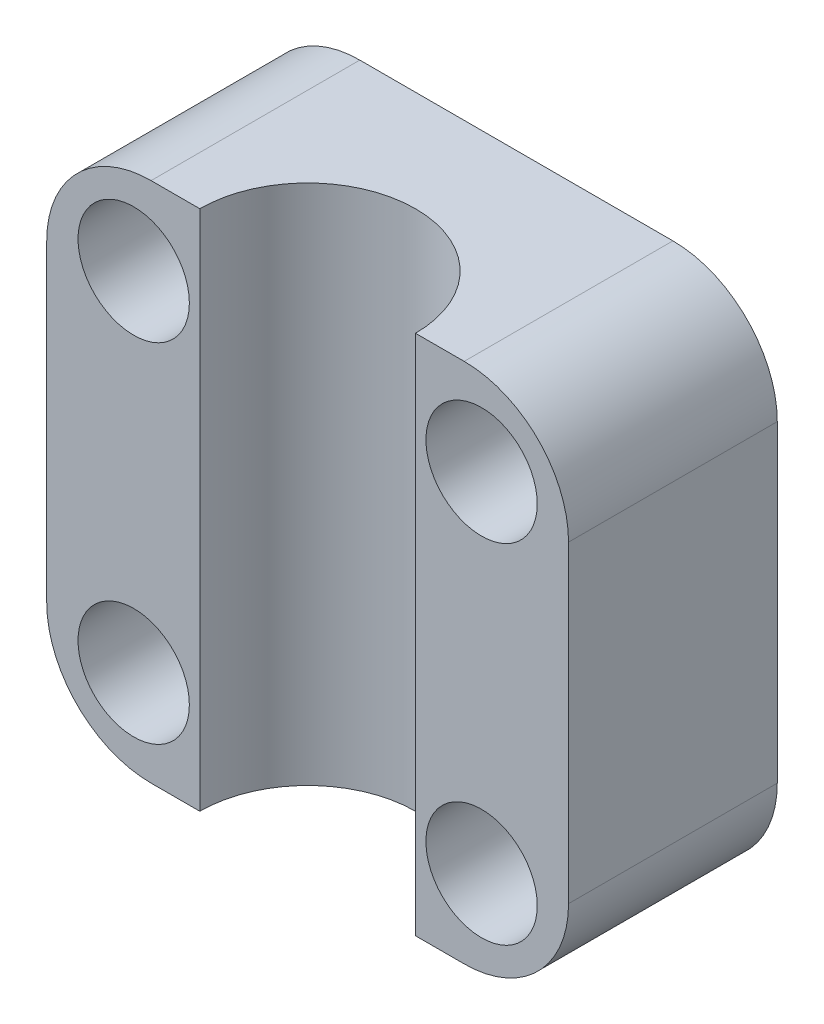
ISO-10303-21;
HEADER;
FILE_DESCRIPTION(('STEP AP214'),'2;1');
FILE_NAME('part.step','',(''),(''),'','','');
FILE_SCHEMA(('AUTOMOTIVE_DESIGN { 1 0 10303 214 1 1 1 1 }'));
ENDSEC;
DATA;
#1=APPLICATION_CONTEXT('core data for automotive mechanical design processes');
#2=APPLICATION_PROTOCOL_DEFINITION('international standard','automotive_design',2000,#1);
#3=PRODUCT_CONTEXT('',#1,'mechanical');
#4=PRODUCT('Part','Part','',(#3));
#5=PRODUCT_RELATED_PRODUCT_CATEGORY('part','',(#4));
#6=PRODUCT_DEFINITION_FORMATION('','',#4);
#7=PRODUCT_DEFINITION_CONTEXT('part definition',#1,'design');
#8=PRODUCT_DEFINITION('design','',#6,#7);
#9=PRODUCT_DEFINITION_SHAPE('','',#8);
#10=(LENGTH_UNIT() NAMED_UNIT(*) SI_UNIT(.MILLI.,.METRE.));
#11=(NAMED_UNIT(*) PLANE_ANGLE_UNIT() SI_UNIT($,.RADIAN.));
#12=(NAMED_UNIT(*) SI_UNIT($,.STERADIAN.) SOLID_ANGLE_UNIT());
#13=UNCERTAINTY_MEASURE_WITH_UNIT(LENGTH_MEASURE(1.E-05),#10,'distance_accuracy_value','');
#14=(GEOMETRIC_REPRESENTATION_CONTEXT(3) GLOBAL_UNCERTAINTY_ASSIGNED_CONTEXT((#13)) GLOBAL_UNIT_ASSIGNED_CONTEXT((#10,
#11,#12)) REPRESENTATION_CONTEXT('',''));
#15=CARTESIAN_POINT('',(0.,0.,0.));
#16=DIRECTION('',(0.,0.,1.));
#17=DIRECTION('',(1.,0.,0.));
#18=AXIS2_PLACEMENT_3D('',#15,#16,#17);
#19=CARTESIAN_POINT('',(-7.5,7.5,-6.));
#20=DIRECTION('',(0.,1.,0.));
#21=DIRECTION('',(-1.,0.,0.));
#22=AXIS2_PLACEMENT_3D('',#19,#20,#21);
#23=PLANE('',#22);
#24=DIRECTION('',(-1.,0.,0.));
#25=VECTOR('',#24,1.);
#26=CARTESIAN_POINT('',(-7.5,7.5,-6.));
#27=LINE('',#26,#25);
#28=CARTESIAN_POINT('',(4.5,7.5,-6.));
#29=VERTEX_POINT('',#28);
#30=CARTESIAN_POINT('',(-4.5,7.5,-6.));
#31=VERTEX_POINT('',#30);
#32=EDGE_CURVE('E175',#29,#31,#27,.T.);
#33=ORIENTED_EDGE('',*,*,#32,.T.);
#34=DIRECTION('',(0.,0.,1.));
#35=VECTOR('',#34,1.);
#36=CARTESIAN_POINT('',(-4.5,7.5,-6.));
#37=LINE('',#36,#35);
#38=CARTESIAN_POINT('',(-4.5,7.5,0.));
#39=VERTEX_POINT('',#38);
#40=EDGE_CURVE('E185',#31,#39,#37,.T.);
#41=ORIENTED_EDGE('',*,*,#40,.T.);
#42=DIRECTION('',(-1.,0.,0.));
#43=VECTOR('',#42,1.);
#44=CARTESIAN_POINT('',(-7.5,7.5,0.));
#45=LINE('',#44,#43);
#46=CARTESIAN_POINT('',(-3.1,7.5,0.));
#47=VERTEX_POINT('',#46);
#48=EDGE_CURVE('E181',#47,#39,#45,.T.);
#49=ORIENTED_EDGE('',*,*,#48,.F.);
#50=CARTESIAN_POINT('',(0.,7.5,0.));
#51=DIRECTION('',(0.,1.,0.));
#52=DIRECTION('',(0.,0.,1.));
#53=AXIS2_PLACEMENT_3D('',#50,#51,#52);
#54=CIRCLE('',#53,3.1);
#55=CARTESIAN_POINT('',(3.1,7.5,0.));
#56=VERTEX_POINT('',#55);
#57=EDGE_CURVE('E130',#56,#47,#54,.T.);
#58=ORIENTED_EDGE('',*,*,#57,.F.);
#59=CARTESIAN_POINT('',(4.5,7.5,0.));
#60=VERTEX_POINT('',#59);
#61=EDGE_CURVE('E170',#60,#56,#45,.T.);
#62=ORIENTED_EDGE('',*,*,#61,.F.);
#63=DIRECTION('',(0.,0.,1.));
#64=VECTOR('',#63,1.);
#65=CARTESIAN_POINT('',(4.5,7.5,-6.));
#66=LINE('',#65,#64);
#67=EDGE_CURVE('E131',#60,#29,#66,.F.);
#68=ORIENTED_EDGE('',*,*,#67,.T.);
#69=EDGE_LOOP('',(#33,#41,#49,#58,#62,#68));
#70=FACE_BOUND('',#69,.T.);
#71=ADVANCED_FACE('F32',(#70),#23,.T.);
#72=CARTESIAN_POINT('',(-7.5,-7.5,-6.));
#73=DIRECTION('',(0.,-1.,0.));
#74=DIRECTION('',(1.,0.,0.));
#75=AXIS2_PLACEMENT_3D('',#72,#73,#74);
#76=PLANE('',#75);
#77=DIRECTION('',(1.,0.,0.));
#78=VECTOR('',#77,1.);
#79=CARTESIAN_POINT('',(-7.5,-7.5,-6.));
#80=LINE('',#79,#78);
#81=CARTESIAN_POINT('',(-4.5,-7.5,-6.));
#82=VERTEX_POINT('',#81);
#83=CARTESIAN_POINT('',(4.5,-7.5,-6.));
#84=VERTEX_POINT('',#83);
#85=EDGE_CURVE('E169',#82,#84,#80,.T.);
#86=ORIENTED_EDGE('',*,*,#85,.T.);
#87=DIRECTION('',(0.,0.,1.));
#88=VECTOR('',#87,1.);
#89=CARTESIAN_POINT('',(4.5,-7.5,-6.));
#90=LINE('',#89,#88);
#91=CARTESIAN_POINT('',(4.5,-7.5,0.));
#92=VERTEX_POINT('',#91);
#93=EDGE_CURVE('E11',#84,#92,#90,.T.);
#94=ORIENTED_EDGE('',*,*,#93,.T.);
#95=DIRECTION('',(1.,0.,0.));
#96=VECTOR('',#95,1.);
#97=CARTESIAN_POINT('',(-7.5,-7.5,0.));
#98=LINE('',#97,#96);
#99=CARTESIAN_POINT('',(3.1,-7.5,0.));
#100=VERTEX_POINT('',#99);
#101=EDGE_CURVE('E122',#100,#92,#98,.T.);
#102=ORIENTED_EDGE('',*,*,#101,.F.);
#103=CARTESIAN_POINT('',(0.,-7.5,0.));
#104=DIRECTION('',(0.,1.,0.));
#105=DIRECTION('',(0.,0.,1.));
#106=AXIS2_PLACEMENT_3D('',#103,#104,#105);
#107=CIRCLE('',#106,3.1);
#108=CARTESIAN_POINT('',(-3.1,-7.5,0.));
#109=VERTEX_POINT('',#108);
#110=EDGE_CURVE('E127',#100,#109,#107,.T.);
#111=ORIENTED_EDGE('',*,*,#110,.T.);
#112=CARTESIAN_POINT('',(-4.5,-7.5,0.));
#113=VERTEX_POINT('',#112);
#114=EDGE_CURVE('E110',#113,#109,#98,.T.);
#115=ORIENTED_EDGE('',*,*,#114,.F.);
#116=DIRECTION('',(0.,0.,1.));
#117=VECTOR('',#116,1.);
#118=CARTESIAN_POINT('',(-4.5,-7.5,-6.));
#119=LINE('',#118,#117);
#120=EDGE_CURVE('E40',#113,#82,#119,.F.);
#121=ORIENTED_EDGE('',*,*,#120,.T.);
#122=EDGE_LOOP('',(#86,#94,#102,#111,#115,#121));
#123=FACE_BOUND('',#122,.T.);
#124=ADVANCED_FACE('F136',(#123),#76,.T.);
#125=CARTESIAN_POINT('',(-7.5,-7.5,0.));
#126=DIRECTION('',(0.,0.,1.));
#127=DIRECTION('',(1.,0.,0.));
#128=AXIS2_PLACEMENT_3D('',#125,#126,#127);
#129=PLANE('',#128);
#130=CARTESIAN_POINT('',(-5.,5.,0.));
#131=DIRECTION('',(0.,0.,1.));
#132=DIRECTION('',(1.,0.,0.));
#133=AXIS2_PLACEMENT_3D('',#130,#131,#132);
#134=CIRCLE('',#133,1.6);
#135=CARTESIAN_POINT('',(-3.4,5.,0.));
#136=VERTEX_POINT('',#135);
#137=EDGE_CURVE('E151',#136,#136,#134,.T.);
#138=ORIENTED_EDGE('',*,*,#137,.F.);
#139=EDGE_LOOP('',(#138));
#140=FACE_BOUND('',#139,.T.);
#141=CARTESIAN_POINT('',(-5.,-5.,0.));
#142=DIRECTION('',(0.,0.,1.));
#143=DIRECTION('',(1.,0.,0.));
#144=AXIS2_PLACEMENT_3D('',#141,#142,#143);
#145=CIRCLE('',#144,1.6);
#146=CARTESIAN_POINT('',(-3.4,-5.,0.));
#147=VERTEX_POINT('',#146);
#148=EDGE_CURVE('E145',#147,#147,#145,.T.);
#149=ORIENTED_EDGE('',*,*,#148,.F.);
#150=EDGE_LOOP('',(#149));
#151=FACE_BOUND('',#150,.T.);
#152=ORIENTED_EDGE('',*,*,#48,.T.);
#153=CARTESIAN_POINT('',(-4.5,4.5,0.));
#154=DIRECTION('',(0.,0.,1.));
#155=DIRECTION('',(1.,0.,0.));
#156=AXIS2_PLACEMENT_3D('',#153,#154,#155);
#157=CIRCLE('',#156,3.);
#158=CARTESIAN_POINT('',(-7.5,4.5,0.));
#159=VERTEX_POINT('',#158);
#160=EDGE_CURVE('E189',#39,#159,#157,.T.);
#161=ORIENTED_EDGE('',*,*,#160,.T.);
#162=DIRECTION('',(0.,-1.,0.));
#163=VECTOR('',#162,1.);
#164=CARTESIAN_POINT('',(-7.5,7.5,0.));
#165=LINE('',#164,#163);
#166=CARTESIAN_POINT('',(-7.5,-4.5,0.));
#167=VERTEX_POINT('',#166);
#168=EDGE_CURVE('E163',#159,#167,#165,.T.);
#169=ORIENTED_EDGE('',*,*,#168,.T.);
#170=CARTESIAN_POINT('',(-4.5,-4.5,0.));
#171=DIRECTION('',(0.,0.,1.));
#172=DIRECTION('',(1.,0.,0.));
#173=AXIS2_PLACEMENT_3D('',#170,#171,#172);
#174=CIRCLE('',#173,3.);
#175=EDGE_CURVE('E117',#167,#113,#174,.T.);
#176=ORIENTED_EDGE('',*,*,#175,.T.);
#177=ORIENTED_EDGE('',*,*,#114,.T.);
#178=DIRECTION('',(0.,-1.,0.));
#179=VECTOR('',#178,1.);
#180=CARTESIAN_POINT('',(-3.1,7.5,0.));
#181=LINE('',#180,#179);
#182=EDGE_CURVE('E114',#109,#47,#181,.F.);
#183=ORIENTED_EDGE('',*,*,#182,.T.);
#184=EDGE_LOOP('',(#152,#161,#169,#176,#177,#183));
#185=FACE_BOUND('',#184,.T.);
#186=ADVANCED_FACE('F113',(#140,#151,#185),#129,.T.);
#187=CARTESIAN_POINT('',(5.,5.,0.));
#188=DIRECTION('',(0.,0.,1.));
#189=DIRECTION('',(1.,0.,0.));
#190=AXIS2_PLACEMENT_3D('',#187,#188,#189);
#191=CIRCLE('',#190,1.6);
#192=CARTESIAN_POINT('',(6.6,5.,0.));
#193=VERTEX_POINT('',#192);
#194=EDGE_CURVE('E157',#193,#193,#191,.T.);
#195=ORIENTED_EDGE('',*,*,#194,.F.);
#196=EDGE_LOOP('',(#195));
#197=FACE_BOUND('',#196,.T.);
#198=CARTESIAN_POINT('',(5.,-5.,0.));
#199=DIRECTION('',(0.,0.,1.));
#200=DIRECTION('',(1.,0.,0.));
#201=AXIS2_PLACEMENT_3D('',#198,#199,#200);
#202=CIRCLE('',#201,1.6);
#203=CARTESIAN_POINT('',(6.6,-5.,0.));
#204=VERTEX_POINT('',#203);
#205=EDGE_CURVE('E139',#204,#204,#202,.T.);
#206=ORIENTED_EDGE('',*,*,#205,.F.);
#207=EDGE_LOOP('',(#206));
#208=FACE_BOUND('',#207,.T.);
#209=DIRECTION('',(0.,1.,0.));
#210=VECTOR('',#209,1.);
#211=CARTESIAN_POINT('',(7.5,7.5,0.));
#212=LINE('',#211,#210);
#213=CARTESIAN_POINT('',(7.5,-4.5,0.));
#214=VERTEX_POINT('',#213);
#215=CARTESIAN_POINT('',(7.5,4.5,0.));
#216=VERTEX_POINT('',#215);
#217=EDGE_CURVE('E121',#214,#216,#212,.T.);
#218=ORIENTED_EDGE('',*,*,#217,.T.);
#219=CARTESIAN_POINT('',(4.5,4.5,0.));
#220=DIRECTION('',(0.,0.,1.));
#221=DIRECTION('',(1.,0.,0.));
#222=AXIS2_PLACEMENT_3D('',#219,#220,#221);
#223=CIRCLE('',#222,3.);
#224=EDGE_CURVE('E54',#216,#60,#223,.T.);
#225=ORIENTED_EDGE('',*,*,#224,.T.);
#226=ORIENTED_EDGE('',*,*,#61,.T.);
#227=DIRECTION('',(0.,-1.,0.));
#228=VECTOR('',#227,1.);
#229=CARTESIAN_POINT('',(3.1,7.5,0.));
#230=LINE('',#229,#228);
#231=EDGE_CURVE('E132',#56,#100,#230,.T.);
#232=ORIENTED_EDGE('',*,*,#231,.T.);
#233=ORIENTED_EDGE('',*,*,#101,.T.);
#234=CARTESIAN_POINT('',(4.5,-4.5,0.));
#235=DIRECTION('',(0.,0.,1.));
#236=DIRECTION('',(1.,0.,0.));
#237=AXIS2_PLACEMENT_3D('',#234,#235,#236);
#238=CIRCLE('',#237,3.);
#239=EDGE_CURVE('E47',#92,#214,#238,.T.);
#240=ORIENTED_EDGE('',*,*,#239,.T.);
#241=EDGE_LOOP('',(#218,#225,#226,#232,#233,#240));
#242=FACE_BOUND('',#241,.T.);
#243=ADVANCED_FACE('F235',(#197,#208,#242),#129,.T.);
#244=CARTESIAN_POINT('',(-7.5,7.5,-6.));
#245=DIRECTION('',(-1.,0.,0.));
#246=DIRECTION('',(0.,0.,1.));
#247=AXIS2_PLACEMENT_3D('',#244,#245,#246);
#248=PLANE('',#247);
#249=ORIENTED_EDGE('',*,*,#168,.F.);
#250=DIRECTION('',(0.,0.,1.));
#251=VECTOR('',#250,1.);
#252=CARTESIAN_POINT('',(-7.5,4.5,-6.));
#253=LINE('',#252,#251);
#254=CARTESIAN_POINT('',(-7.5,4.5,-6.));
#255=VERTEX_POINT('',#254);
#256=EDGE_CURVE('E194',#159,#255,#253,.F.);
#257=ORIENTED_EDGE('',*,*,#256,.T.);
#258=DIRECTION('',(0.,-1.,0.));
#259=VECTOR('',#258,1.);
#260=CARTESIAN_POINT('',(-7.5,7.5,-6.));
#261=LINE('',#260,#259);
#262=CARTESIAN_POINT('',(-7.5,-4.5,-6.));
#263=VERTEX_POINT('',#262);
#264=EDGE_CURVE('E166',#255,#263,#261,.T.);
#265=ORIENTED_EDGE('',*,*,#264,.T.);
#266=DIRECTION('',(0.,0.,1.));
#267=VECTOR('',#266,1.);
#268=CARTESIAN_POINT('',(-7.5,-4.5,-6.));
#269=LINE('',#268,#267);
#270=EDGE_CURVE('E191',#263,#167,#269,.T.);
#271=ORIENTED_EDGE('',*,*,#270,.T.);
#272=EDGE_LOOP('',(#249,#257,#265,#271));
#273=FACE_BOUND('',#272,.T.);
#274=ADVANCED_FACE('F220',(#273),#248,.T.);
#275=CARTESIAN_POINT('',(7.5,7.5,-6.));
#276=DIRECTION('',(1.,0.,0.));
#277=DIRECTION('',(0.,1.,0.));
#278=AXIS2_PLACEMENT_3D('',#275,#276,#277);
#279=PLANE('',#278);
#280=DIRECTION('',(0.,1.,0.));
#281=VECTOR('',#280,1.);
#282=CARTESIAN_POINT('',(7.5,7.5,-6.));
#283=LINE('',#282,#281);
#284=CARTESIAN_POINT('',(7.5,-4.5,-6.));
#285=VERTEX_POINT('',#284);
#286=CARTESIAN_POINT('',(7.5,4.5,-6.));
#287=VERTEX_POINT('',#286);
#288=EDGE_CURVE('E172',#285,#287,#283,.T.);
#289=ORIENTED_EDGE('',*,*,#288,.T.);
#290=DIRECTION('',(0.,0.,1.));
#291=VECTOR('',#290,1.);
#292=CARTESIAN_POINT('',(7.5,4.5,-6.));
#293=LINE('',#292,#291);
#294=EDGE_CURVE('E206',#287,#216,#293,.T.);
#295=ORIENTED_EDGE('',*,*,#294,.T.);
#296=ORIENTED_EDGE('',*,*,#217,.F.);
#297=DIRECTION('',(0.,0.,1.));
#298=VECTOR('',#297,1.);
#299=CARTESIAN_POINT('',(7.5,-4.5,-6.));
#300=LINE('',#299,#298);
#301=EDGE_CURVE('E204',#214,#285,#300,.F.);
#302=ORIENTED_EDGE('',*,*,#301,.T.);
#303=EDGE_LOOP('',(#289,#295,#296,#302));
#304=FACE_BOUND('',#303,.T.);
#305=ADVANCED_FACE('F233',(#304),#279,.T.);
#306=CARTESIAN_POINT('',(-7.5,-7.5,-6.));
#307=DIRECTION('',(0.,0.,1.));
#308=DIRECTION('',(1.,0.,0.));
#309=AXIS2_PLACEMENT_3D('',#306,#307,#308);
#310=PLANE('',#309);
#311=CARTESIAN_POINT('',(5.,-5.,-6.));
#312=DIRECTION('',(0.,0.,1.));
#313=DIRECTION('',(1.,0.,0.));
#314=AXIS2_PLACEMENT_3D('',#311,#312,#313);
#315=CIRCLE('',#314,1.6);
#316=CARTESIAN_POINT('',(6.6,-5.,-6.));
#317=VERTEX_POINT('',#316);
#318=EDGE_CURVE('E142',#317,#317,#315,.T.);
#319=ORIENTED_EDGE('',*,*,#318,.T.);
#320=EDGE_LOOP('',(#319));
#321=FACE_BOUND('',#320,.T.);
#322=CARTESIAN_POINT('',(-5.,-5.,-6.));
#323=DIRECTION('',(0.,0.,1.));
#324=DIRECTION('',(1.,0.,0.));
#325=AXIS2_PLACEMENT_3D('',#322,#323,#324);
#326=CIRCLE('',#325,1.6);
#327=CARTESIAN_POINT('',(-3.4,-5.,-6.));
#328=VERTEX_POINT('',#327);
#329=EDGE_CURVE('E148',#328,#328,#326,.T.);
#330=ORIENTED_EDGE('',*,*,#329,.T.);
#331=EDGE_LOOP('',(#330));
#332=FACE_BOUND('',#331,.T.);
#333=CARTESIAN_POINT('',(-5.,5.,-6.));
#334=DIRECTION('',(0.,0.,1.));
#335=DIRECTION('',(1.,0.,0.));
#336=AXIS2_PLACEMENT_3D('',#333,#334,#335);
#337=CIRCLE('',#336,1.6);
#338=CARTESIAN_POINT('',(-3.4,5.,-6.));
#339=VERTEX_POINT('',#338);
#340=EDGE_CURVE('E154',#339,#339,#337,.T.);
#341=ORIENTED_EDGE('',*,*,#340,.T.);
#342=EDGE_LOOP('',(#341));
#343=FACE_BOUND('',#342,.T.);
#344=CARTESIAN_POINT('',(5.,5.,-6.));
#345=DIRECTION('',(0.,0.,1.));
#346=DIRECTION('',(1.,0.,0.));
#347=AXIS2_PLACEMENT_3D('',#344,#345,#346);
#348=CIRCLE('',#347,1.6);
#349=CARTESIAN_POINT('',(6.6,5.,-6.));
#350=VERTEX_POINT('',#349);
#351=EDGE_CURVE('E160',#350,#350,#348,.T.);
#352=ORIENTED_EDGE('',*,*,#351,.T.);
#353=EDGE_LOOP('',(#352));
#354=FACE_BOUND('',#353,.T.);
#355=ORIENTED_EDGE('',*,*,#264,.F.);
#356=CARTESIAN_POINT('',(-4.5,4.5,-6.));
#357=DIRECTION('',(0.,0.,1.));
#358=DIRECTION('',(1.,0.,0.));
#359=AXIS2_PLACEMENT_3D('',#356,#357,#358);
#360=CIRCLE('',#359,3.);
#361=EDGE_CURVE('E202',#255,#31,#360,.F.);
#362=ORIENTED_EDGE('',*,*,#361,.T.);
#363=ORIENTED_EDGE('',*,*,#32,.F.);
#364=CARTESIAN_POINT('',(4.5,4.5,-6.));
#365=DIRECTION('',(0.,0.,1.));
#366=DIRECTION('',(1.,0.,0.));
#367=AXIS2_PLACEMENT_3D('',#364,#365,#366);
#368=CIRCLE('',#367,3.);
#369=EDGE_CURVE('E200',#29,#287,#368,.F.);
#370=ORIENTED_EDGE('',*,*,#369,.T.);
#371=ORIENTED_EDGE('',*,*,#288,.F.);
#372=CARTESIAN_POINT('',(4.5,-4.5,-6.));
#373=DIRECTION('',(0.,0.,1.));
#374=DIRECTION('',(1.,0.,0.));
#375=AXIS2_PLACEMENT_3D('',#372,#373,#374);
#376=CIRCLE('',#375,3.);
#377=EDGE_CURVE('E198',#285,#84,#376,.F.);
#378=ORIENTED_EDGE('',*,*,#377,.T.);
#379=ORIENTED_EDGE('',*,*,#85,.F.);
#380=CARTESIAN_POINT('',(-4.5,-4.5,-6.));
#381=DIRECTION('',(0.,0.,1.));
#382=DIRECTION('',(1.,0.,0.));
#383=AXIS2_PLACEMENT_3D('',#380,#381,#382);
#384=CIRCLE('',#383,3.);
#385=EDGE_CURVE('E196',#82,#263,#384,.F.);
#386=ORIENTED_EDGE('',*,*,#385,.T.);
#387=EDGE_LOOP('',(#355,#362,#363,#370,#371,#378,#379,#386));
#388=FACE_BOUND('',#387,.T.);
#389=ADVANCED_FACE('F214',(#321,#332,#343,#354,#388),#310,.F.);
#390=CARTESIAN_POINT('',(5.,5.,-6.));
#391=DIRECTION('',(0.,0.,1.));
#392=DIRECTION('',(1.,0.,0.));
#393=AXIS2_PLACEMENT_3D('',#390,#391,#392);
#394=CYLINDRICAL_SURFACE('',#393,1.6);
#395=ORIENTED_EDGE('',*,*,#351,.F.);
#396=EDGE_LOOP('',(#395));
#397=FACE_BOUND('',#396,.T.);
#398=ORIENTED_EDGE('',*,*,#194,.T.);
#399=EDGE_LOOP('',(#398));
#400=FACE_BOUND('',#399,.T.);
#401=ADVANCED_FACE('F294',(#397,#400),#394,.F.);
#402=CARTESIAN_POINT('',(-5.,5.,-6.));
#403=DIRECTION('',(0.,0.,1.));
#404=DIRECTION('',(1.,0.,0.));
#405=AXIS2_PLACEMENT_3D('',#402,#403,#404);
#406=CYLINDRICAL_SURFACE('',#405,1.6);
#407=ORIENTED_EDGE('',*,*,#340,.F.);
#408=EDGE_LOOP('',(#407));
#409=FACE_BOUND('',#408,.T.);
#410=ORIENTED_EDGE('',*,*,#137,.T.);
#411=EDGE_LOOP('',(#410));
#412=FACE_BOUND('',#411,.T.);
#413=ADVANCED_FACE('F354',(#409,#412),#406,.F.);
#414=CARTESIAN_POINT('',(-5.,-5.,-6.));
#415=DIRECTION('',(0.,0.,1.));
#416=DIRECTION('',(1.,0.,0.));
#417=AXIS2_PLACEMENT_3D('',#414,#415,#416);
#418=CYLINDRICAL_SURFACE('',#417,1.6);
#419=ORIENTED_EDGE('',*,*,#329,.F.);
#420=EDGE_LOOP('',(#419));
#421=FACE_BOUND('',#420,.T.);
#422=ORIENTED_EDGE('',*,*,#148,.T.);
#423=EDGE_LOOP('',(#422));
#424=FACE_BOUND('',#423,.T.);
#425=ADVANCED_FACE('F344',(#421,#424),#418,.F.);
#426=CARTESIAN_POINT('',(5.,-5.,-6.));
#427=DIRECTION('',(0.,0.,1.));
#428=DIRECTION('',(1.,0.,0.));
#429=AXIS2_PLACEMENT_3D('',#426,#427,#428);
#430=CYLINDRICAL_SURFACE('',#429,1.6);
#431=ORIENTED_EDGE('',*,*,#318,.F.);
#432=EDGE_LOOP('',(#431));
#433=FACE_BOUND('',#432,.T.);
#434=ORIENTED_EDGE('',*,*,#205,.T.);
#435=EDGE_LOOP('',(#434));
#436=FACE_BOUND('',#435,.T.);
#437=ADVANCED_FACE('F336',(#433,#436),#430,.F.);
#438=CARTESIAN_POINT('',(0.,7.5,0.));
#439=DIRECTION('',(0.,-1.,0.));
#440=DIRECTION('',(0.,0.,-1.));
#441=AXIS2_PLACEMENT_3D('',#438,#439,#440);
#442=CYLINDRICAL_SURFACE('',#441,3.1);
#443=ORIENTED_EDGE('',*,*,#110,.F.);
#444=ORIENTED_EDGE('',*,*,#231,.F.);
#445=ORIENTED_EDGE('',*,*,#57,.T.);
#446=ORIENTED_EDGE('',*,*,#182,.F.);
#447=EDGE_LOOP('',(#443,#444,#445,#446));
#448=FACE_BOUND('',#447,.T.);
#449=ADVANCED_FACE('F125',(#448),#442,.F.);
#450=CARTESIAN_POINT('',(-4.5,4.5,-6.));
#451=DIRECTION('',(0.,0.,1.));
#452=DIRECTION('',(1.,0.,0.));
#453=AXIS2_PLACEMENT_3D('',#450,#451,#452);
#454=CYLINDRICAL_SURFACE('',#453,3.);
#455=ORIENTED_EDGE('',*,*,#361,.F.);
#456=ORIENTED_EDGE('',*,*,#256,.F.);
#457=ORIENTED_EDGE('',*,*,#160,.F.);
#458=ORIENTED_EDGE('',*,*,#40,.F.);
#459=EDGE_LOOP('',(#455,#456,#457,#458));
#460=FACE_BOUND('',#459,.T.);
#461=ADVANCED_FACE('F225',(#460),#454,.T.);
#462=CARTESIAN_POINT('',(4.5,4.5,-6.));
#463=DIRECTION('',(0.,0.,1.));
#464=DIRECTION('',(1.,0.,0.));
#465=AXIS2_PLACEMENT_3D('',#462,#463,#464);
#466=CYLINDRICAL_SURFACE('',#465,3.);
#467=ORIENTED_EDGE('',*,*,#369,.F.);
#468=ORIENTED_EDGE('',*,*,#67,.F.);
#469=ORIENTED_EDGE('',*,*,#224,.F.);
#470=ORIENTED_EDGE('',*,*,#294,.F.);
#471=EDGE_LOOP('',(#467,#468,#469,#470));
#472=FACE_BOUND('',#471,.T.);
#473=ADVANCED_FACE('F230',(#472),#466,.T.);
#474=CARTESIAN_POINT('',(4.5,-4.5,-6.));
#475=DIRECTION('',(0.,0.,1.));
#476=DIRECTION('',(1.,0.,0.));
#477=AXIS2_PLACEMENT_3D('',#474,#475,#476);
#478=CYLINDRICAL_SURFACE('',#477,3.);
#479=ORIENTED_EDGE('',*,*,#377,.F.);
#480=ORIENTED_EDGE('',*,*,#301,.F.);
#481=ORIENTED_EDGE('',*,*,#239,.F.);
#482=ORIENTED_EDGE('',*,*,#93,.F.);
#483=EDGE_LOOP('',(#479,#480,#481,#482));
#484=FACE_BOUND('',#483,.T.);
#485=ADVANCED_FACE('F260',(#484),#478,.T.);
#486=CARTESIAN_POINT('',(-4.5,-4.5,-6.));
#487=DIRECTION('',(0.,0.,1.));
#488=DIRECTION('',(1.,0.,0.));
#489=AXIS2_PLACEMENT_3D('',#486,#487,#488);
#490=CYLINDRICAL_SURFACE('',#489,3.);
#491=ORIENTED_EDGE('',*,*,#385,.F.);
#492=ORIENTED_EDGE('',*,*,#120,.F.);
#493=ORIENTED_EDGE('',*,*,#175,.F.);
#494=ORIENTED_EDGE('',*,*,#270,.F.);
#495=EDGE_LOOP('',(#491,#492,#493,#494));
#496=FACE_BOUND('',#495,.T.);
#497=ADVANCED_FACE('F34',(#496),#490,.T.);
#498=CLOSED_SHELL('',(#71,#124,#186,#243,#274,#305,#389,#401,#413,#425,#437,#449,#461,#473,#485,#497));
#499=MANIFOLD_SOLID_BREP('B2',#498);
#500=ADVANCED_BREP_SHAPE_REPRESENTATION('',(#18,#499),#14);
#501=SHAPE_DEFINITION_REPRESENTATION(#9,#500);
ENDSEC;
END-ISO-10303-21;
